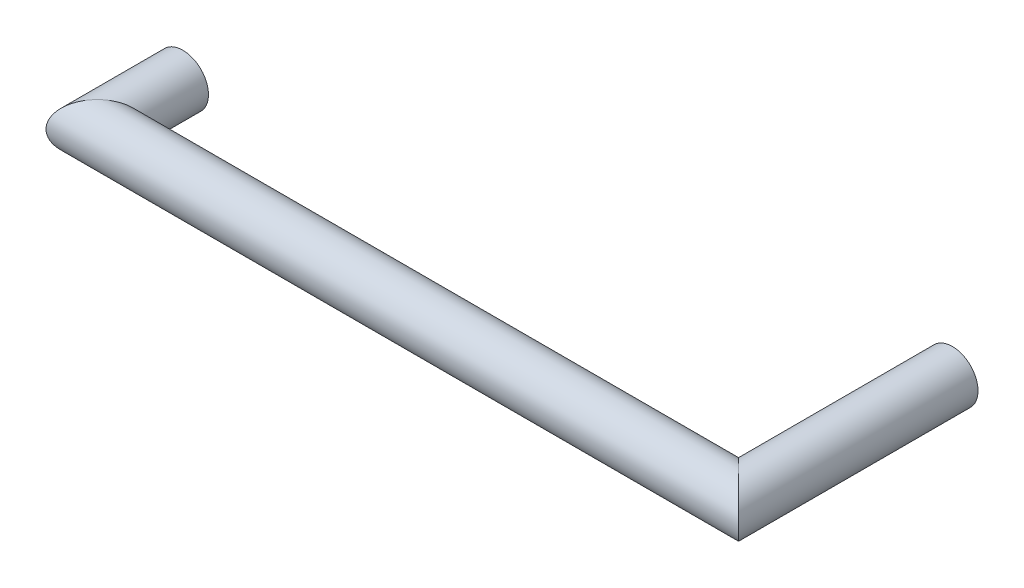
ISO-10303-21;
HEADER;
FILE_DESCRIPTION(('STEP AP214'),'2;1');
FILE_NAME('part.step','',(''),(''),'','','');
FILE_SCHEMA(('AUTOMOTIVE_DESIGN { 1 0 10303 214 1 1 1 1 }'));
ENDSEC;
DATA;
#1=APPLICATION_CONTEXT('core data for automotive mechanical design processes');
#2=APPLICATION_PROTOCOL_DEFINITION('international standard','automotive_design',2000,#1);
#3=PRODUCT_CONTEXT('',#1,'mechanical');
#4=PRODUCT('Part','Part','',(#3));
#5=PRODUCT_RELATED_PRODUCT_CATEGORY('part','',(#4));
#6=PRODUCT_DEFINITION_FORMATION('','',#4);
#7=PRODUCT_DEFINITION_CONTEXT('part definition',#1,'design');
#8=PRODUCT_DEFINITION('design','',#6,#7);
#9=PRODUCT_DEFINITION_SHAPE('','',#8);
#10=(LENGTH_UNIT() NAMED_UNIT(*) SI_UNIT(.MILLI.,.METRE.));
#11=(NAMED_UNIT(*) PLANE_ANGLE_UNIT() SI_UNIT($,.RADIAN.));
#12=(NAMED_UNIT(*) SI_UNIT($,.STERADIAN.) SOLID_ANGLE_UNIT());
#13=UNCERTAINTY_MEASURE_WITH_UNIT(LENGTH_MEASURE(1.E-05),#10,'distance_accuracy_value','');
#14=(GEOMETRIC_REPRESENTATION_CONTEXT(3) GLOBAL_UNCERTAINTY_ASSIGNED_CONTEXT((#13)) GLOBAL_UNIT_ASSIGNED_CONTEXT((#10,
#11,#12)) REPRESENTATION_CONTEXT('',''));
#15=CARTESIAN_POINT('',(0.,0.,0.));
#16=DIRECTION('',(0.,0.,1.));
#17=DIRECTION('',(1.,0.,0.));
#18=AXIS2_PLACEMENT_3D('',#15,#16,#17);
#19=CARTESIAN_POINT('',(-7.5,0.,-2.));
#20=DIRECTION('',(0.,0.,-1.));
#21=DIRECTION('',(-1.,0.,0.));
#22=AXIS2_PLACEMENT_3D('',#19,#20,#21);
#23=PLANE('',#22);
#24=CARTESIAN_POINT('',(-7.5,0.,-2.));
#25=DIRECTION('',(0.,0.,-1.));
#26=DIRECTION('',(-1.,0.,0.));
#27=AXIS2_PLACEMENT_3D('',#24,#25,#26);
#28=CIRCLE('',#27,0.6);
#29=CARTESIAN_POINT('',(-8.1,0.,-2.));
#30=VERTEX_POINT('',#29);
#31=EDGE_CURVE('E35',#30,#30,#28,.T.);
#32=ORIENTED_EDGE('',*,*,#31,.T.);
#33=EDGE_LOOP('',(#32));
#34=FACE_BOUND('',#33,.T.);
#35=ADVANCED_FACE('F32',(#34),#23,.T.);
#36=CARTESIAN_POINT('',(7.5,0.,-5.));
#37=DIRECTION('',(0.,0.,1.));
#38=DIRECTION('',(1.,0.,0.));
#39=AXIS2_PLACEMENT_3D('',#36,#37,#38);
#40=PLANE('',#39);
#41=CARTESIAN_POINT('',(7.5,0.,-5.));
#42=DIRECTION('',(0.,0.,1.));
#43=DIRECTION('',(1.,0.,0.));
#44=AXIS2_PLACEMENT_3D('',#41,#42,#43);
#45=CIRCLE('',#44,0.6);
#46=CARTESIAN_POINT('',(8.1,0.,-5.));
#47=VERTEX_POINT('',#46);
#48=EDGE_CURVE('E39',#47,#47,#45,.T.);
#49=ORIENTED_EDGE('',*,*,#48,.F.);
#50=EDGE_LOOP('',(#49));
#51=FACE_BOUND('',#50,.T.);
#52=ADVANCED_FACE('F56',(#51),#40,.F.);
#53=CARTESIAN_POINT('',(-7.5,0.,0.76));
#54=DIRECTION('',(0.,0.,-1.));
#55=DIRECTION('',(-1.,0.,0.));
#56=AXIS2_PLACEMENT_3D('',#53,#54,#55);
#57=CYLINDRICAL_SURFACE('',#56,0.6);
#58=CARTESIAN_POINT('',(-7.5,0.,0.));
#59=DIRECTION('',(-0.707106781186548,0.,-0.707106781186547));
#60=DIRECTION('',(-0.707106781186547,0.,0.707106781186548));
#61=AXIS2_PLACEMENT_3D('',#58,#59,#60);
#62=ELLIPSE('',#61,0.848528137423857,0.6);
#63=CARTESIAN_POINT('',(-8.1,0.,0.600000000000001));
#64=VERTEX_POINT('',#63);
#65=EDGE_CURVE('E44',#64,#64,#62,.F.);
#66=ORIENTED_EDGE('',*,*,#65,.F.);
#67=EDGE_LOOP('',(#66));
#68=FACE_BOUND('',#67,.T.);
#69=ORIENTED_EDGE('',*,*,#31,.F.);
#70=EDGE_LOOP('',(#69));
#71=FACE_BOUND('',#70,.T.);
#72=ADVANCED_FACE('F53',(#68,#71),#57,.T.);
#73=CARTESIAN_POINT('',(8.26,0.,0.));
#74=DIRECTION('',(-1.,0.,0.));
#75=DIRECTION('',(0.,0.,1.));
#76=AXIS2_PLACEMENT_3D('',#73,#74,#75);
#77=CYLINDRICAL_SURFACE('',#76,0.6);
#78=CARTESIAN_POINT('',(7.5,0.,0.));
#79=DIRECTION('',(-0.707106781186547,0.,0.707106781186548));
#80=DIRECTION('',(0.707106781186548,0.,0.707106781186547));
#81=AXIS2_PLACEMENT_3D('',#78,#79,#80);
#82=ELLIPSE('',#81,0.848528137423857,0.6);
#83=CARTESIAN_POINT('',(8.1,0.,0.599999999999998));
#84=VERTEX_POINT('',#83);
#85=EDGE_CURVE('E10',#84,#84,#82,.F.);
#86=ORIENTED_EDGE('',*,*,#85,.F.);
#87=EDGE_LOOP('',(#86));
#88=FACE_BOUND('',#87,.T.);
#89=ORIENTED_EDGE('',*,*,#65,.T.);
#90=EDGE_LOOP('',(#89));
#91=FACE_BOUND('',#90,.T.);
#92=ADVANCED_FACE('F55',(#88,#91),#77,.T.);
#93=CARTESIAN_POINT('',(7.5,0.,-5.));
#94=DIRECTION('',(0.,0.,1.));
#95=DIRECTION('',(1.,0.,0.));
#96=AXIS2_PLACEMENT_3D('',#93,#94,#95);
#97=CYLINDRICAL_SURFACE('',#96,0.6);
#98=ORIENTED_EDGE('',*,*,#48,.T.);
#99=EDGE_LOOP('',(#98));
#100=FACE_BOUND('',#99,.T.);
#101=ORIENTED_EDGE('',*,*,#85,.T.);
#102=EDGE_LOOP('',(#101));
#103=FACE_BOUND('',#102,.T.);
#104=ADVANCED_FACE('F63',(#100,#103),#97,.T.);
#105=CLOSED_SHELL('',(#35,#52,#72,#92,#104));
#106=MANIFOLD_SOLID_BREP('B2',#105);
#107=ADVANCED_BREP_SHAPE_REPRESENTATION('',(#18,#106),#14);
#108=SHAPE_DEFINITION_REPRESENTATION(#9,#107);
ENDSEC;
END-ISO-10303-21;
